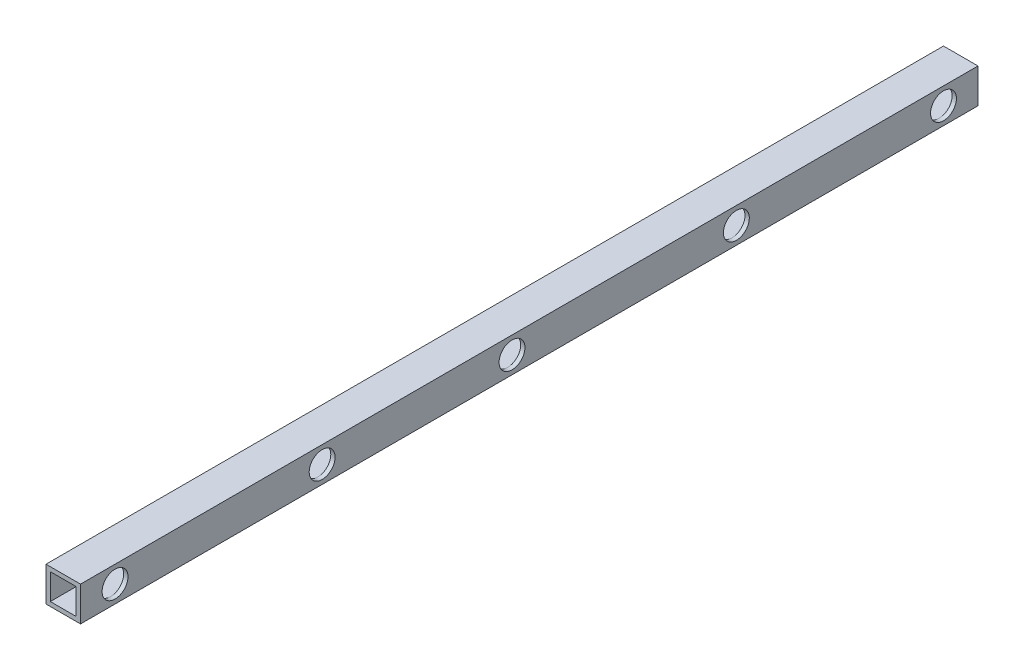
ISO-10303-21;
HEADER;
FILE_DESCRIPTION(('STEP AP214'),'2;1');
FILE_NAME('part.step','',(''),(''),'','','');
FILE_SCHEMA(('AUTOMOTIVE_DESIGN { 1 0 10303 214 1 1 1 1 }'));
ENDSEC;
DATA;
#1=APPLICATION_CONTEXT('core data for automotive mechanical design processes');
#2=APPLICATION_PROTOCOL_DEFINITION('international standard','automotive_design',2000,#1);
#3=PRODUCT_CONTEXT('',#1,'mechanical');
#4=PRODUCT('Part','Part','',(#3));
#5=PRODUCT_RELATED_PRODUCT_CATEGORY('part','',(#4));
#6=PRODUCT_DEFINITION_FORMATION('','',#4);
#7=PRODUCT_DEFINITION_CONTEXT('part definition',#1,'design');
#8=PRODUCT_DEFINITION('design','',#6,#7);
#9=PRODUCT_DEFINITION_SHAPE('','',#8);
#10=(LENGTH_UNIT() NAMED_UNIT(*) SI_UNIT(.MILLI.,.METRE.));
#11=(NAMED_UNIT(*) PLANE_ANGLE_UNIT() SI_UNIT($,.RADIAN.));
#12=(NAMED_UNIT(*) SI_UNIT($,.STERADIAN.) SOLID_ANGLE_UNIT());
#13=UNCERTAINTY_MEASURE_WITH_UNIT(LENGTH_MEASURE(1.E-05),#10,'distance_accuracy_value','');
#14=(GEOMETRIC_REPRESENTATION_CONTEXT(3) GLOBAL_UNCERTAINTY_ASSIGNED_CONTEXT((#13)) GLOBAL_UNIT_ASSIGNED_CONTEXT((#10,
#11,#12)) REPRESENTATION_CONTEXT('',''));
#15=CARTESIAN_POINT('',(0.,0.,0.));
#16=DIRECTION('',(0.,0.,1.));
#17=DIRECTION('',(1.,0.,0.));
#18=AXIS2_PLACEMENT_3D('',#15,#16,#17);
#19=CARTESIAN_POINT('',(-3.175,0.,660.4));
#20=DIRECTION('',(-1.,0.,0.));
#21=DIRECTION('',(0.,-1.,0.));
#22=AXIS2_PLACEMENT_3D('',#19,#20,#21);
#23=PLANE('',#22);
#24=CARTESIAN_POINT('',(-3.175,12.7,25.4));
#25=DIRECTION('',(-1.,0.,0.));
#26=DIRECTION('',(0.,-1.,0.));
#27=AXIS2_PLACEMENT_3D('',#24,#25,#26);
#28=CIRCLE('',#27,9.525);
#29=CARTESIAN_POINT('',(-3.175,3.175,25.4));
#30=VERTEX_POINT('',#29);
#31=CARTESIAN_POINT('',(-3.175,22.225,25.4));
#32=VERTEX_POINT('',#31);
#33=EDGE_CURVE('E77',#30,#32,#28,.T.);
#34=ORIENTED_EDGE('',*,*,#33,.F.);
#35=DIRECTION('',(0.,0.,-1.));
#36=VECTOR('',#35,1.);
#37=CARTESIAN_POINT('',(-3.175,3.175,660.4));
#38=LINE('',#37,#36);
#39=CARTESIAN_POINT('',(-3.175,3.175,177.8));
#40=VERTEX_POINT('',#39);
#41=EDGE_CURVE('E208',#40,#30,#38,.T.);
#42=ORIENTED_EDGE('',*,*,#41,.F.);
#43=CARTESIAN_POINT('',(-3.175,12.7,177.8));
#44=DIRECTION('',(-1.,0.,0.));
#45=DIRECTION('',(0.,-1.,0.));
#46=AXIS2_PLACEMENT_3D('',#43,#44,#45);
#47=CIRCLE('',#46,9.525);
#48=CARTESIAN_POINT('',(-3.175,22.225,177.8));
#49=VERTEX_POINT('',#48);
#50=EDGE_CURVE('E185',#49,#40,#47,.T.);
#51=ORIENTED_EDGE('',*,*,#50,.F.);
#52=DIRECTION('',(0.,0.,-1.));
#53=VECTOR('',#52,1.);
#54=CARTESIAN_POINT('',(-3.175,22.225,660.4));
#55=LINE('',#54,#53);
#56=EDGE_CURVE('E418',#49,#32,#55,.T.);
#57=ORIENTED_EDGE('',*,*,#56,.T.);
#58=EDGE_LOOP('',(#34,#42,#51,#57));
#59=FACE_BOUND('',#58,.T.);
#60=ADVANCED_FACE('F62',(#59),#23,.T.);
#61=CARTESIAN_POINT('',(-3.175,12.7,342.9));
#62=DIRECTION('',(-1.,0.,0.));
#63=DIRECTION('',(0.,-1.,0.));
#64=AXIS2_PLACEMENT_3D('',#61,#62,#63);
#65=CIRCLE('',#64,9.52500000000002);
#66=CARTESIAN_POINT('',(-3.175,3.17499999999999,342.9));
#67=VERTEX_POINT('',#66);
#68=CARTESIAN_POINT('',(-3.175,22.225,342.9));
#69=VERTEX_POINT('',#68);
#70=EDGE_CURVE('E477',#67,#69,#65,.T.);
#71=ORIENTED_EDGE('',*,*,#70,.F.);
#72=CARTESIAN_POINT('',(-3.175,3.17499999999999,482.6));
#73=VERTEX_POINT('',#72);
#74=EDGE_CURVE('E218',#73,#67,#38,.T.);
#75=ORIENTED_EDGE('',*,*,#74,.F.);
#76=CARTESIAN_POINT('',(-3.175,12.7,482.6));
#77=DIRECTION('',(-1.,0.,0.));
#78=DIRECTION('',(0.,-1.,0.));
#79=AXIS2_PLACEMENT_3D('',#76,#77,#78);
#80=CIRCLE('',#79,9.52500000000002);
#81=CARTESIAN_POINT('',(-3.175,22.225,482.6));
#82=VERTEX_POINT('',#81);
#83=EDGE_CURVE('E446',#82,#73,#80,.T.);
#84=ORIENTED_EDGE('',*,*,#83,.F.);
#85=EDGE_CURVE('E368',#82,#69,#55,.T.);
#86=ORIENTED_EDGE('',*,*,#85,.T.);
#87=EDGE_LOOP('',(#71,#75,#84,#86));
#88=FACE_BOUND('',#87,.T.);
#89=ADVANCED_FACE('F316',(#88),#23,.T.);
#90=CARTESIAN_POINT('',(-3.175,12.7,635.));
#91=DIRECTION('',(-1.,0.,0.));
#92=DIRECTION('',(0.,-1.,0.));
#93=AXIS2_PLACEMENT_3D('',#90,#91,#92);
#94=CIRCLE('',#93,9.52500000000002);
#95=CARTESIAN_POINT('',(-3.175,3.17499999999999,635.));
#96=VERTEX_POINT('',#95);
#97=CARTESIAN_POINT('',(-3.175,22.225,635.));
#98=VERTEX_POINT('',#97);
#99=EDGE_CURVE('E361',#96,#98,#94,.T.);
#100=ORIENTED_EDGE('',*,*,#99,.F.);
#101=CARTESIAN_POINT('',(-3.175,3.175,660.4));
#102=VERTEX_POINT('',#101);
#103=EDGE_CURVE('E222',#102,#96,#38,.T.);
#104=ORIENTED_EDGE('',*,*,#103,.F.);
#105=DIRECTION('',(0.,1.,0.));
#106=VECTOR('',#105,1.);
#107=CARTESIAN_POINT('',(-3.175,0.,660.4));
#108=LINE('',#107,#106);
#109=CARTESIAN_POINT('',(-3.175,22.225,660.4));
#110=VERTEX_POINT('',#109);
#111=EDGE_CURVE('E372',#102,#110,#108,.T.);
#112=ORIENTED_EDGE('',*,*,#111,.T.);
#113=EDGE_CURVE('E242',#110,#98,#55,.T.);
#114=ORIENTED_EDGE('',*,*,#113,.T.);
#115=EDGE_LOOP('',(#100,#104,#112,#114));
#116=FACE_BOUND('',#115,.T.);
#117=ADVANCED_FACE('F323',(#116),#23,.T.);
#118=EDGE_CURVE('E355',#98,#96,#94,.T.);
#119=ORIENTED_EDGE('',*,*,#118,.F.);
#120=EDGE_CURVE('E247',#98,#82,#55,.T.);
#121=ORIENTED_EDGE('',*,*,#120,.T.);
#122=EDGE_CURVE('E484',#73,#82,#80,.T.);
#123=ORIENTED_EDGE('',*,*,#122,.F.);
#124=EDGE_CURVE('E221',#96,#73,#38,.T.);
#125=ORIENTED_EDGE('',*,*,#124,.F.);
#126=EDGE_LOOP('',(#119,#121,#123,#125));
#127=FACE_BOUND('',#126,.T.);
#128=ADVANCED_FACE('F339',(#127),#23,.T.);
#129=EDGE_CURVE('E457',#69,#67,#65,.T.);
#130=ORIENTED_EDGE('',*,*,#129,.F.);
#131=EDGE_CURVE('E204',#69,#49,#55,.T.);
#132=ORIENTED_EDGE('',*,*,#131,.T.);
#133=EDGE_CURVE('E84',#40,#49,#47,.T.);
#134=ORIENTED_EDGE('',*,*,#133,.F.);
#135=EDGE_CURVE('E201',#67,#40,#38,.T.);
#136=ORIENTED_EDGE('',*,*,#135,.F.);
#137=EDGE_LOOP('',(#130,#132,#134,#136));
#138=FACE_BOUND('',#137,.T.);
#139=ADVANCED_FACE('F199',(#138),#23,.T.);
#140=CARTESIAN_POINT('',(-22.225,0.,660.4));
#141=DIRECTION('',(1.,0.,0.));
#142=DIRECTION('',(0.,0.,-1.));
#143=AXIS2_PLACEMENT_3D('',#140,#141,#142);
#144=PLANE('',#143);
#145=CARTESIAN_POINT('',(-22.225,12.7,25.4));
#146=DIRECTION('',(1.,0.,0.));
#147=DIRECTION('',(0.,0.,-1.));
#148=AXIS2_PLACEMENT_3D('',#145,#146,#147);
#149=CIRCLE('',#148,9.525);
#150=CARTESIAN_POINT('',(-22.225,22.225,25.4));
#151=VERTEX_POINT('',#150);
#152=CARTESIAN_POINT('',(-22.225,3.175,25.4));
#153=VERTEX_POINT('',#152);
#154=EDGE_CURVE('E472',#151,#153,#149,.T.);
#155=ORIENTED_EDGE('',*,*,#154,.F.);
#156=DIRECTION('',(0.,0.,-1.));
#157=VECTOR('',#156,1.);
#158=CARTESIAN_POINT('',(-22.225,22.225,660.4));
#159=LINE('',#158,#157);
#160=CARTESIAN_POINT('',(-22.225,22.225,177.8));
#161=VERTEX_POINT('',#160);
#162=EDGE_CURVE('E421',#161,#151,#159,.T.);
#163=ORIENTED_EDGE('',*,*,#162,.F.);
#164=CARTESIAN_POINT('',(-22.225,12.7,177.8));
#165=DIRECTION('',(1.,0.,0.));
#166=DIRECTION('',(0.,0.,-1.));
#167=AXIS2_PLACEMENT_3D('',#164,#165,#166);
#168=CIRCLE('',#167,9.525);
#169=CARTESIAN_POINT('',(-22.225,3.175,177.8));
#170=VERTEX_POINT('',#169);
#171=EDGE_CURVE('E469',#170,#161,#168,.T.);
#172=ORIENTED_EDGE('',*,*,#171,.F.);
#173=DIRECTION('',(0.,0.,-1.));
#174=VECTOR('',#173,1.);
#175=CARTESIAN_POINT('',(-22.225,3.175,660.4));
#176=LINE('',#175,#174);
#177=EDGE_CURVE('E413',#170,#153,#176,.T.);
#178=ORIENTED_EDGE('',*,*,#177,.T.);
#179=EDGE_LOOP('',(#155,#163,#172,#178));
#180=FACE_BOUND('',#179,.T.);
#181=ADVANCED_FACE('F338',(#180),#144,.T.);
#182=CARTESIAN_POINT('',(-22.225,12.7,342.9));
#183=DIRECTION('',(1.,0.,0.));
#184=DIRECTION('',(0.,0.,-1.));
#185=AXIS2_PLACEMENT_3D('',#182,#183,#184);
#186=CIRCLE('',#185,9.52500000000002);
#187=CARTESIAN_POINT('',(-22.225,22.225,342.9));
#188=VERTEX_POINT('',#187);
#189=CARTESIAN_POINT('',(-22.225,3.175,342.9));
#190=VERTEX_POINT('',#189);
#191=EDGE_CURVE('E452',#188,#190,#186,.T.);
#192=ORIENTED_EDGE('',*,*,#191,.F.);
#193=CARTESIAN_POINT('',(-22.225,22.225,482.6));
#194=VERTEX_POINT('',#193);
#195=EDGE_CURVE('E426',#194,#188,#159,.T.);
#196=ORIENTED_EDGE('',*,*,#195,.F.);
#197=CARTESIAN_POINT('',(-22.225,12.7,482.6));
#198=DIRECTION('',(1.,0.,0.));
#199=DIRECTION('',(0.,0.,-1.));
#200=AXIS2_PLACEMENT_3D('',#197,#198,#199);
#201=CIRCLE('',#200,9.52500000000002);
#202=CARTESIAN_POINT('',(-22.225,3.175,482.6));
#203=VERTEX_POINT('',#202);
#204=EDGE_CURVE('E206',#203,#194,#201,.T.);
#205=ORIENTED_EDGE('',*,*,#204,.F.);
#206=EDGE_CURVE('E453',#203,#190,#176,.T.);
#207=ORIENTED_EDGE('',*,*,#206,.T.);
#208=EDGE_LOOP('',(#192,#196,#205,#207));
#209=FACE_BOUND('',#208,.T.);
#210=ADVANCED_FACE('F344',(#209),#144,.T.);
#211=CARTESIAN_POINT('',(-22.225,12.7,635.));
#212=DIRECTION('',(1.,0.,0.));
#213=DIRECTION('',(0.,0.,-1.));
#214=AXIS2_PLACEMENT_3D('',#211,#212,#213);
#215=CIRCLE('',#214,9.52500000000002);
#216=CARTESIAN_POINT('',(-22.225,22.225,635.));
#217=VERTEX_POINT('',#216);
#218=CARTESIAN_POINT('',(-22.225,3.175,635.));
#219=VERTEX_POINT('',#218);
#220=EDGE_CURVE('E362',#217,#219,#215,.T.);
#221=ORIENTED_EDGE('',*,*,#220,.F.);
#222=CARTESIAN_POINT('',(-22.225,22.225,660.4));
#223=VERTEX_POINT('',#222);
#224=EDGE_CURVE('E236',#223,#217,#159,.T.);
#225=ORIENTED_EDGE('',*,*,#224,.F.);
#226=DIRECTION('',(0.,-1.,0.));
#227=VECTOR('',#226,1.);
#228=CARTESIAN_POINT('',(-22.225,0.,660.4));
#229=LINE('',#228,#227);
#230=CARTESIAN_POINT('',(-22.225,3.175,660.4));
#231=VERTEX_POINT('',#230);
#232=EDGE_CURVE('E379',#223,#231,#229,.T.);
#233=ORIENTED_EDGE('',*,*,#232,.T.);
#234=EDGE_CURVE('E230',#231,#219,#176,.T.);
#235=ORIENTED_EDGE('',*,*,#234,.T.);
#236=EDGE_LOOP('',(#221,#225,#233,#235));
#237=FACE_BOUND('',#236,.T.);
#238=ADVANCED_FACE('F581',(#237),#144,.T.);
#239=EDGE_CURVE('E440',#219,#217,#215,.T.);
#240=ORIENTED_EDGE('',*,*,#239,.F.);
#241=EDGE_CURVE('E235',#219,#203,#176,.T.);
#242=ORIENTED_EDGE('',*,*,#241,.T.);
#243=EDGE_CURVE('E442',#194,#203,#201,.T.);
#244=ORIENTED_EDGE('',*,*,#243,.F.);
#245=EDGE_CURVE('E241',#217,#194,#159,.T.);
#246=ORIENTED_EDGE('',*,*,#245,.F.);
#247=EDGE_LOOP('',(#240,#242,#244,#246));
#248=FACE_BOUND('',#247,.T.);
#249=ADVANCED_FACE('F438',(#248),#144,.T.);
#250=EDGE_CURVE('E458',#190,#188,#186,.T.);
#251=ORIENTED_EDGE('',*,*,#250,.F.);
#252=EDGE_CURVE('E465',#190,#170,#176,.T.);
#253=ORIENTED_EDGE('',*,*,#252,.T.);
#254=EDGE_CURVE('E193',#161,#170,#168,.T.);
#255=ORIENTED_EDGE('',*,*,#254,.F.);
#256=EDGE_CURVE('E424',#188,#161,#159,.T.);
#257=ORIENTED_EDGE('',*,*,#256,.F.);
#258=EDGE_LOOP('',(#251,#253,#255,#257));
#259=FACE_BOUND('',#258,.T.);
#260=ADVANCED_FACE('F462',(#259),#144,.T.);
#261=CARTESIAN_POINT('',(0.,0.,660.4));
#262=DIRECTION('',(0.,0.,1.));
#263=DIRECTION('',(1.,0.,0.));
#264=AXIS2_PLACEMENT_3D('',#261,#262,#263);
#265=PLANE('',#264);
#266=DIRECTION('',(0.,1.,0.));
#267=VECTOR('',#266,1.);
#268=CARTESIAN_POINT('',(0.,0.,660.4));
#269=LINE('',#268,#267);
#270=CARTESIAN_POINT('',(0.,0.,660.4));
#271=VERTEX_POINT('',#270);
#272=CARTESIAN_POINT('',(0.,25.4,660.4));
#273=VERTEX_POINT('',#272);
#274=EDGE_CURVE('E248',#271,#273,#269,.T.);
#275=ORIENTED_EDGE('',*,*,#274,.T.);
#276=DIRECTION('',(-1.,0.,0.));
#277=VECTOR('',#276,1.);
#278=CARTESIAN_POINT('',(0.,25.4,660.4));
#279=LINE('',#278,#277);
#280=CARTESIAN_POINT('',(-25.4,25.4,660.4));
#281=VERTEX_POINT('',#280);
#282=EDGE_CURVE('E252',#273,#281,#279,.T.);
#283=ORIENTED_EDGE('',*,*,#282,.T.);
#284=DIRECTION('',(0.,-1.,0.));
#285=VECTOR('',#284,1.);
#286=CARTESIAN_POINT('',(-25.4,0.,660.4));
#287=LINE('',#286,#285);
#288=CARTESIAN_POINT('',(-25.4,0.,660.4));
#289=VERTEX_POINT('',#288);
#290=EDGE_CURVE('E256',#281,#289,#287,.T.);
#291=ORIENTED_EDGE('',*,*,#290,.T.);
#292=DIRECTION('',(1.,0.,0.));
#293=VECTOR('',#292,1.);
#294=CARTESIAN_POINT('',(0.,0.,660.4));
#295=LINE('',#294,#293);
#296=EDGE_CURVE('E259',#289,#271,#295,.T.);
#297=ORIENTED_EDGE('',*,*,#296,.T.);
#298=EDGE_LOOP('',(#275,#283,#291,#297));
#299=FACE_BOUND('',#298,.T.);
#300=DIRECTION('',(-1.,0.,0.));
#301=VECTOR('',#300,1.);
#302=CARTESIAN_POINT('',(0.,22.225,660.4));
#303=LINE('',#302,#301);
#304=EDGE_CURVE('E375',#110,#223,#303,.T.);
#305=ORIENTED_EDGE('',*,*,#304,.F.);
#306=ORIENTED_EDGE('',*,*,#111,.F.);
#307=DIRECTION('',(1.,0.,0.));
#308=VECTOR('',#307,1.);
#309=CARTESIAN_POINT('',(0.,3.175,660.4));
#310=LINE('',#309,#308);
#311=EDGE_CURVE('E390',#231,#102,#310,.T.);
#312=ORIENTED_EDGE('',*,*,#311,.F.);
#313=ORIENTED_EDGE('',*,*,#232,.F.);
#314=EDGE_LOOP('',(#305,#306,#312,#313));
#315=FACE_BOUND('',#314,.T.);
#316=ADVANCED_FACE('F302',(#299,#315),#265,.T.);
#317=CARTESIAN_POINT('',(0.,0.,0.));
#318=DIRECTION('',(0.,0.,1.));
#319=DIRECTION('',(1.,0.,0.));
#320=AXIS2_PLACEMENT_3D('',#317,#318,#319);
#321=PLANE('',#320);
#322=DIRECTION('',(0.,1.,0.));
#323=VECTOR('',#322,1.);
#324=CARTESIAN_POINT('',(0.,0.,0.));
#325=LINE('',#324,#323);
#326=CARTESIAN_POINT('',(0.,0.,0.));
#327=VERTEX_POINT('',#326);
#328=CARTESIAN_POINT('',(0.,25.4,0.));
#329=VERTEX_POINT('',#328);
#330=EDGE_CURVE('E246',#327,#329,#325,.T.);
#331=ORIENTED_EDGE('',*,*,#330,.F.);
#332=DIRECTION('',(1.,0.,0.));
#333=VECTOR('',#332,1.);
#334=CARTESIAN_POINT('',(0.,0.,0.));
#335=LINE('',#334,#333);
#336=CARTESIAN_POINT('',(-25.4,0.,0.));
#337=VERTEX_POINT('',#336);
#338=EDGE_CURVE('E253',#337,#327,#335,.T.);
#339=ORIENTED_EDGE('',*,*,#338,.F.);
#340=DIRECTION('',(0.,-1.,0.));
#341=VECTOR('',#340,1.);
#342=CARTESIAN_POINT('',(-25.4,0.,0.));
#343=LINE('',#342,#341);
#344=CARTESIAN_POINT('',(-25.4,25.4,0.));
#345=VERTEX_POINT('',#344);
#346=EDGE_CURVE('E269',#345,#337,#343,.T.);
#347=ORIENTED_EDGE('',*,*,#346,.F.);
#348=DIRECTION('',(-1.,0.,0.));
#349=VECTOR('',#348,1.);
#350=CARTESIAN_POINT('',(0.,25.4,0.));
#351=LINE('',#350,#349);
#352=EDGE_CURVE('E266',#329,#345,#351,.T.);
#353=ORIENTED_EDGE('',*,*,#352,.F.);
#354=EDGE_LOOP('',(#331,#339,#347,#353));
#355=FACE_BOUND('',#354,.T.);
#356=DIRECTION('',(0.,1.,0.));
#357=VECTOR('',#356,1.);
#358=CARTESIAN_POINT('',(-3.175,0.,0.));
#359=LINE('',#358,#357);
#360=CARTESIAN_POINT('',(-3.175,3.175,0.));
#361=VERTEX_POINT('',#360);
#362=CARTESIAN_POINT('',(-3.175,22.225,0.));
#363=VERTEX_POINT('',#362);
#364=EDGE_CURVE('E393',#361,#363,#359,.T.);
#365=ORIENTED_EDGE('',*,*,#364,.T.);
#366=DIRECTION('',(-1.,0.,0.));
#367=VECTOR('',#366,1.);
#368=CARTESIAN_POINT('',(0.,22.225,0.));
#369=LINE('',#368,#367);
#370=CARTESIAN_POINT('',(-22.225,22.225,0.));
#371=VERTEX_POINT('',#370);
#372=EDGE_CURVE('E397',#363,#371,#369,.T.);
#373=ORIENTED_EDGE('',*,*,#372,.T.);
#374=DIRECTION('',(0.,-1.,0.));
#375=VECTOR('',#374,1.);
#376=CARTESIAN_POINT('',(-22.225,0.,0.));
#377=LINE('',#376,#375);
#378=CARTESIAN_POINT('',(-22.225,3.175,0.));
#379=VERTEX_POINT('',#378);
#380=EDGE_CURVE('E382',#371,#379,#377,.T.);
#381=ORIENTED_EDGE('',*,*,#380,.T.);
#382=DIRECTION('',(1.,0.,0.));
#383=VECTOR('',#382,1.);
#384=CARTESIAN_POINT('',(0.,3.175,0.));
#385=LINE('',#384,#383);
#386=EDGE_CURVE('E228',#379,#361,#385,.T.);
#387=ORIENTED_EDGE('',*,*,#386,.T.);
#388=EDGE_LOOP('',(#365,#373,#381,#387));
#389=FACE_BOUND('',#388,.T.);
#390=ADVANCED_FACE('F292',(#355,#389),#321,.F.);
#391=CARTESIAN_POINT('',(0.,0.,660.4));
#392=DIRECTION('',(-1.,0.,0.));
#393=DIRECTION('',(0.,-1.,0.));
#394=AXIS2_PLACEMENT_3D('',#391,#392,#393);
#395=PLANE('',#394);
#396=CARTESIAN_POINT('',(0.,12.7,25.4));
#397=DIRECTION('',(-1.,0.,0.));
#398=DIRECTION('',(0.,0.,1.));
#399=AXIS2_PLACEMENT_3D('',#396,#397,#398);
#400=CIRCLE('',#399,9.525);
#401=CARTESIAN_POINT('',(0.,12.7,34.925));
#402=VERTEX_POINT('',#401);
#403=EDGE_CURVE('E489',#402,#402,#400,.T.);
#404=ORIENTED_EDGE('',*,*,#403,.T.);
#405=EDGE_LOOP('',(#404));
#406=FACE_BOUND('',#405,.T.);
#407=CARTESIAN_POINT('',(0.,12.7,342.9));
#408=DIRECTION('',(-1.,0.,0.));
#409=DIRECTION('',(0.,0.,1.));
#410=AXIS2_PLACEMENT_3D('',#407,#408,#409);
#411=CIRCLE('',#410,9.52500000000002);
#412=CARTESIAN_POINT('',(0.,12.7,352.425));
#413=VERTEX_POINT('',#412);
#414=EDGE_CURVE('E512',#413,#413,#411,.T.);
#415=ORIENTED_EDGE('',*,*,#414,.T.);
#416=EDGE_LOOP('',(#415));
#417=FACE_BOUND('',#416,.T.);
#418=CARTESIAN_POINT('',(0.,12.7,635.));
#419=DIRECTION('',(-1.,0.,0.));
#420=DIRECTION('',(0.,0.,1.));
#421=AXIS2_PLACEMENT_3D('',#418,#419,#420);
#422=CIRCLE('',#421,9.52500000000002);
#423=CARTESIAN_POINT('',(0.,12.7,644.525));
#424=VERTEX_POINT('',#423);
#425=EDGE_CURVE('E495',#424,#424,#422,.T.);
#426=ORIENTED_EDGE('',*,*,#425,.T.);
#427=EDGE_LOOP('',(#426));
#428=FACE_BOUND('',#427,.T.);
#429=CARTESIAN_POINT('',(0.,12.7,482.6));
#430=DIRECTION('',(-1.,0.,0.));
#431=DIRECTION('',(0.,0.,1.));
#432=AXIS2_PLACEMENT_3D('',#429,#430,#431);
#433=CIRCLE('',#432,9.52500000000002);
#434=CARTESIAN_POINT('',(0.,12.7,492.125));
#435=VERTEX_POINT('',#434);
#436=EDGE_CURVE('E494',#435,#435,#433,.T.);
#437=ORIENTED_EDGE('',*,*,#436,.T.);
#438=EDGE_LOOP('',(#437));
#439=FACE_BOUND('',#438,.T.);
#440=CARTESIAN_POINT('',(0.,12.7,177.8));
#441=DIRECTION('',(-1.,0.,0.));
#442=DIRECTION('',(0.,0.,1.));
#443=AXIS2_PLACEMENT_3D('',#440,#441,#442);
#444=CIRCLE('',#443,9.525);
#445=CARTESIAN_POINT('',(0.,12.7,187.325));
#446=VERTEX_POINT('',#445);
#447=EDGE_CURVE('E503',#446,#446,#444,.T.);
#448=ORIENTED_EDGE('',*,*,#447,.T.);
#449=EDGE_LOOP('',(#448));
#450=FACE_BOUND('',#449,.T.);
#451=ORIENTED_EDGE('',*,*,#330,.T.);
#452=DIRECTION('',(0.,0.,-1.));
#453=VECTOR('',#452,1.);
#454=CARTESIAN_POINT('',(0.,25.4,660.4));
#455=LINE('',#454,#453);
#456=EDGE_CURVE('E12',#273,#329,#455,.T.);
#457=ORIENTED_EDGE('',*,*,#456,.F.);
#458=ORIENTED_EDGE('',*,*,#274,.F.);
#459=DIRECTION('',(0.,0.,-1.));
#460=VECTOR('',#459,1.);
#461=CARTESIAN_POINT('',(0.,0.,660.4));
#462=LINE('',#461,#460);
#463=EDGE_CURVE('E262',#271,#327,#462,.T.);
#464=ORIENTED_EDGE('',*,*,#463,.T.);
#465=EDGE_LOOP('',(#451,#457,#458,#464));
#466=FACE_BOUND('',#465,.T.);
#467=ADVANCED_FACE('F64',(#406,#417,#428,#439,#450,#466),#395,.F.);
#468=CARTESIAN_POINT('',(0.,25.4,660.4));
#469=DIRECTION('',(0.,-1.,0.));
#470=DIRECTION('',(1.,0.,0.));
#471=AXIS2_PLACEMENT_3D('',#468,#469,#470);
#472=PLANE('',#471);
#473=ORIENTED_EDGE('',*,*,#352,.T.);
#474=DIRECTION('',(0.,0.,-1.));
#475=VECTOR('',#474,1.);
#476=CARTESIAN_POINT('',(-25.4,25.4,660.4));
#477=LINE('',#476,#475);
#478=EDGE_CURVE('E71',#281,#345,#477,.T.);
#479=ORIENTED_EDGE('',*,*,#478,.F.);
#480=ORIENTED_EDGE('',*,*,#282,.F.);
#481=ORIENTED_EDGE('',*,*,#456,.T.);
#482=EDGE_LOOP('',(#473,#479,#480,#481));
#483=FACE_BOUND('',#482,.T.);
#484=ADVANCED_FACE('F304',(#483),#472,.F.);
#485=CARTESIAN_POINT('',(-25.4,0.,660.4));
#486=DIRECTION('',(1.,0.,0.));
#487=DIRECTION('',(0.,0.,-1.));
#488=AXIS2_PLACEMENT_3D('',#485,#486,#487);
#489=PLANE('',#488);
#490=CARTESIAN_POINT('',(-25.4,12.7,25.4));
#491=DIRECTION('',(-1.,0.,0.));
#492=DIRECTION('',(0.,0.,1.));
#493=AXIS2_PLACEMENT_3D('',#490,#491,#492);
#494=CIRCLE('',#493,9.525);
#495=CARTESIAN_POINT('',(-25.4,12.7,34.925));
#496=VERTEX_POINT('',#495);
#497=EDGE_CURVE('E507',#496,#496,#494,.T.);
#498=ORIENTED_EDGE('',*,*,#497,.F.);
#499=EDGE_LOOP('',(#498));
#500=FACE_BOUND('',#499,.T.);
#501=CARTESIAN_POINT('',(-25.4,12.7,342.9));
#502=DIRECTION('',(-1.,0.,0.));
#503=DIRECTION('',(0.,0.,1.));
#504=AXIS2_PLACEMENT_3D('',#501,#502,#503);
#505=CIRCLE('',#504,9.52500000000002);
#506=CARTESIAN_POINT('',(-25.4,12.7,352.425));
#507=VERTEX_POINT('',#506);
#508=EDGE_CURVE('E508',#507,#507,#505,.T.);
#509=ORIENTED_EDGE('',*,*,#508,.F.);
#510=EDGE_LOOP('',(#509));
#511=FACE_BOUND('',#510,.T.);
#512=CARTESIAN_POINT('',(-25.4,12.7,635.));
#513=DIRECTION('',(-1.,0.,0.));
#514=DIRECTION('',(0.,0.,1.));
#515=AXIS2_PLACEMENT_3D('',#512,#513,#514);
#516=CIRCLE('',#515,9.52500000000002);
#517=CARTESIAN_POINT('',(-25.4,12.7,644.525));
#518=VERTEX_POINT('',#517);
#519=EDGE_CURVE('E516',#518,#518,#516,.T.);
#520=ORIENTED_EDGE('',*,*,#519,.F.);
#521=EDGE_LOOP('',(#520));
#522=FACE_BOUND('',#521,.T.);
#523=CARTESIAN_POINT('',(-25.4,12.7,482.6));
#524=DIRECTION('',(-1.,0.,0.));
#525=DIRECTION('',(0.,0.,1.));
#526=AXIS2_PLACEMENT_3D('',#523,#524,#525);
#527=CIRCLE('',#526,9.52500000000002);
#528=CARTESIAN_POINT('',(-25.4,12.7,492.125));
#529=VERTEX_POINT('',#528);
#530=EDGE_CURVE('E490',#529,#529,#527,.T.);
#531=ORIENTED_EDGE('',*,*,#530,.F.);
#532=EDGE_LOOP('',(#531));
#533=FACE_BOUND('',#532,.T.);
#534=CARTESIAN_POINT('',(-25.4,12.7,177.8));
#535=DIRECTION('',(-1.,0.,0.));
#536=DIRECTION('',(0.,0.,1.));
#537=AXIS2_PLACEMENT_3D('',#534,#535,#536);
#538=CIRCLE('',#537,9.525);
#539=CARTESIAN_POINT('',(-25.4,12.7,187.325));
#540=VERTEX_POINT('',#539);
#541=EDGE_CURVE('E499',#540,#540,#538,.T.);
#542=ORIENTED_EDGE('',*,*,#541,.F.);
#543=EDGE_LOOP('',(#542));
#544=FACE_BOUND('',#543,.T.);
#545=ORIENTED_EDGE('',*,*,#346,.T.);
#546=DIRECTION('',(0.,0.,-1.));
#547=VECTOR('',#546,1.);
#548=CARTESIAN_POINT('',(-25.4,0.,660.4));
#549=LINE('',#548,#547);
#550=EDGE_CURVE('E277',#289,#337,#549,.T.);
#551=ORIENTED_EDGE('',*,*,#550,.F.);
#552=ORIENTED_EDGE('',*,*,#290,.F.);
#553=ORIENTED_EDGE('',*,*,#478,.T.);
#554=EDGE_LOOP('',(#545,#551,#552,#553));
#555=FACE_BOUND('',#554,.T.);
#556=ADVANCED_FACE('F286',(#500,#511,#522,#533,#544,#555),#489,.F.);
#557=CARTESIAN_POINT('',(0.,0.,660.4));
#558=DIRECTION('',(0.,1.,0.));
#559=DIRECTION('',(0.,0.,1.));
#560=AXIS2_PLACEMENT_3D('',#557,#558,#559);
#561=PLANE('',#560);
#562=ORIENTED_EDGE('',*,*,#338,.T.);
#563=ORIENTED_EDGE('',*,*,#463,.F.);
#564=ORIENTED_EDGE('',*,*,#296,.F.);
#565=ORIENTED_EDGE('',*,*,#550,.T.);
#566=EDGE_LOOP('',(#562,#563,#564,#565));
#567=FACE_BOUND('',#566,.T.);
#568=ADVANCED_FACE('F296',(#567),#561,.F.);
#569=EDGE_CURVE('E384',#32,#30,#28,.T.);
#570=ORIENTED_EDGE('',*,*,#569,.F.);
#571=EDGE_CURVE('E240',#32,#363,#55,.T.);
#572=ORIENTED_EDGE('',*,*,#571,.T.);
#573=ORIENTED_EDGE('',*,*,#364,.F.);
#574=EDGE_CURVE('E212',#30,#361,#38,.T.);
#575=ORIENTED_EDGE('',*,*,#574,.F.);
#576=EDGE_LOOP('',(#570,#572,#573,#575));
#577=FACE_BOUND('',#576,.T.);
#578=ADVANCED_FACE('F318',(#577),#23,.T.);
#579=CARTESIAN_POINT('',(0.,22.225,660.4));
#580=DIRECTION('',(0.,-1.,0.));
#581=DIRECTION('',(1.,0.,0.));
#582=AXIS2_PLACEMENT_3D('',#579,#580,#581);
#583=PLANE('',#582);
#584=ORIENTED_EDGE('',*,*,#224,.T.);
#585=ORIENTED_EDGE('',*,*,#245,.T.);
#586=ORIENTED_EDGE('',*,*,#195,.T.);
#587=ORIENTED_EDGE('',*,*,#256,.T.);
#588=ORIENTED_EDGE('',*,*,#162,.T.);
#589=EDGE_CURVE('E234',#151,#371,#159,.T.);
#590=ORIENTED_EDGE('',*,*,#589,.T.);
#591=ORIENTED_EDGE('',*,*,#372,.F.);
#592=ORIENTED_EDGE('',*,*,#571,.F.);
#593=ORIENTED_EDGE('',*,*,#56,.F.);
#594=ORIENTED_EDGE('',*,*,#131,.F.);
#595=ORIENTED_EDGE('',*,*,#85,.F.);
#596=ORIENTED_EDGE('',*,*,#120,.F.);
#597=ORIENTED_EDGE('',*,*,#113,.F.);
#598=ORIENTED_EDGE('',*,*,#304,.T.);
#599=EDGE_LOOP('',(#584,#585,#586,#587,#588,#590,#591,#592,#593,#594,#595,#596,#597,#598));
#600=FACE_BOUND('',#599,.T.);
#601=ADVANCED_FACE('F328',(#600),#583,.T.);
#602=EDGE_CURVE('E409',#153,#151,#149,.T.);
#603=ORIENTED_EDGE('',*,*,#602,.F.);
#604=EDGE_CURVE('E227',#153,#379,#176,.T.);
#605=ORIENTED_EDGE('',*,*,#604,.T.);
#606=ORIENTED_EDGE('',*,*,#380,.F.);
#607=ORIENTED_EDGE('',*,*,#589,.F.);
#608=EDGE_LOOP('',(#603,#605,#606,#607));
#609=FACE_BOUND('',#608,.T.);
#610=ADVANCED_FACE('F333',(#609),#144,.T.);
#611=CARTESIAN_POINT('',(0.,3.175,660.4));
#612=DIRECTION('',(0.,1.,0.));
#613=DIRECTION('',(0.,0.,1.));
#614=AXIS2_PLACEMENT_3D('',#611,#612,#613);
#615=PLANE('',#614);
#616=ORIENTED_EDGE('',*,*,#604,.F.);
#617=ORIENTED_EDGE('',*,*,#177,.F.);
#618=ORIENTED_EDGE('',*,*,#252,.F.);
#619=ORIENTED_EDGE('',*,*,#206,.F.);
#620=ORIENTED_EDGE('',*,*,#241,.F.);
#621=ORIENTED_EDGE('',*,*,#234,.F.);
#622=ORIENTED_EDGE('',*,*,#311,.T.);
#623=ORIENTED_EDGE('',*,*,#103,.T.);
#624=ORIENTED_EDGE('',*,*,#124,.T.);
#625=ORIENTED_EDGE('',*,*,#74,.T.);
#626=ORIENTED_EDGE('',*,*,#135,.T.);
#627=ORIENTED_EDGE('',*,*,#41,.T.);
#628=ORIENTED_EDGE('',*,*,#574,.T.);
#629=ORIENTED_EDGE('',*,*,#386,.F.);
#630=EDGE_LOOP('',(#616,#617,#618,#619,#620,#621,#622,#623,#624,#625,#626,#627,#628,#629));
#631=FACE_BOUND('',#630,.T.);
#632=ADVANCED_FACE('F215',(#631),#615,.T.);
#633=CARTESIAN_POINT('',(0.,12.7,177.8));
#634=DIRECTION('',(-1.,0.,0.));
#635=DIRECTION('',(0.,0.,1.));
#636=AXIS2_PLACEMENT_3D('',#633,#634,#635);
#637=CYLINDRICAL_SURFACE('',#636,9.525);
#638=ORIENTED_EDGE('',*,*,#254,.T.);
#639=ORIENTED_EDGE('',*,*,#171,.T.);
#640=EDGE_LOOP('',(#638,#639));
#641=FACE_BOUND('',#640,.T.);
#642=ORIENTED_EDGE('',*,*,#541,.T.);
#643=EDGE_LOOP('',(#642));
#644=FACE_BOUND('',#643,.T.);
#645=ADVANCED_FACE('F551',(#641,#644),#637,.F.);
#646=CARTESIAN_POINT('',(0.,12.7,482.6));
#647=DIRECTION('',(-1.,0.,0.));
#648=DIRECTION('',(0.,0.,1.));
#649=AXIS2_PLACEMENT_3D('',#646,#647,#648);
#650=CYLINDRICAL_SURFACE('',#649,9.52500000000002);
#651=ORIENTED_EDGE('',*,*,#243,.T.);
#652=ORIENTED_EDGE('',*,*,#204,.T.);
#653=EDGE_LOOP('',(#651,#652));
#654=FACE_BOUND('',#653,.T.);
#655=ORIENTED_EDGE('',*,*,#530,.T.);
#656=EDGE_LOOP('',(#655));
#657=FACE_BOUND('',#656,.T.);
#658=ADVANCED_FACE('F565',(#654,#657),#650,.F.);
#659=CARTESIAN_POINT('',(0.,12.7,635.));
#660=DIRECTION('',(-1.,0.,0.));
#661=DIRECTION('',(0.,0.,1.));
#662=AXIS2_PLACEMENT_3D('',#659,#660,#661);
#663=CYLINDRICAL_SURFACE('',#662,9.52500000000002);
#664=ORIENTED_EDGE('',*,*,#220,.T.);
#665=ORIENTED_EDGE('',*,*,#239,.T.);
#666=EDGE_LOOP('',(#664,#665));
#667=FACE_BOUND('',#666,.T.);
#668=ORIENTED_EDGE('',*,*,#519,.T.);
#669=EDGE_LOOP('',(#668));
#670=FACE_BOUND('',#669,.T.);
#671=ADVANCED_FACE('F552',(#667,#670),#663,.F.);
#672=CARTESIAN_POINT('',(0.,12.7,342.9));
#673=DIRECTION('',(-1.,0.,0.));
#674=DIRECTION('',(0.,0.,1.));
#675=AXIS2_PLACEMENT_3D('',#672,#673,#674);
#676=CYLINDRICAL_SURFACE('',#675,9.52500000000002);
#677=ORIENTED_EDGE('',*,*,#191,.T.);
#678=ORIENTED_EDGE('',*,*,#250,.T.);
#679=EDGE_LOOP('',(#677,#678));
#680=FACE_BOUND('',#679,.T.);
#681=ORIENTED_EDGE('',*,*,#508,.T.);
#682=EDGE_LOOP('',(#681));
#683=FACE_BOUND('',#682,.T.);
#684=ADVANCED_FACE('F542',(#680,#683),#676,.F.);
#685=CARTESIAN_POINT('',(0.,12.7,25.4));
#686=DIRECTION('',(-1.,0.,0.));
#687=DIRECTION('',(0.,0.,1.));
#688=AXIS2_PLACEMENT_3D('',#685,#686,#687);
#689=CYLINDRICAL_SURFACE('',#688,9.525);
#690=ORIENTED_EDGE('',*,*,#154,.T.);
#691=ORIENTED_EDGE('',*,*,#602,.T.);
#692=EDGE_LOOP('',(#690,#691));
#693=FACE_BOUND('',#692,.T.);
#694=ORIENTED_EDGE('',*,*,#497,.T.);
#695=EDGE_LOOP('',(#694));
#696=FACE_BOUND('',#695,.T.);
#697=ADVANCED_FACE('F535',(#693,#696),#689,.F.);
#698=ORIENTED_EDGE('',*,*,#133,.T.);
#699=ORIENTED_EDGE('',*,*,#50,.T.);
#700=EDGE_LOOP('',(#698,#699));
#701=FACE_BOUND('',#700,.T.);
#702=ORIENTED_EDGE('',*,*,#447,.F.);
#703=EDGE_LOOP('',(#702));
#704=FACE_BOUND('',#703,.T.);
#705=ADVANCED_FACE('F186',(#701,#704),#637,.F.);
#706=ORIENTED_EDGE('',*,*,#122,.T.);
#707=ORIENTED_EDGE('',*,*,#83,.T.);
#708=EDGE_LOOP('',(#706,#707));
#709=FACE_BOUND('',#708,.T.);
#710=ORIENTED_EDGE('',*,*,#436,.F.);
#711=EDGE_LOOP('',(#710));
#712=FACE_BOUND('',#711,.T.);
#713=ADVANCED_FACE('F549',(#709,#712),#650,.F.);
#714=ORIENTED_EDGE('',*,*,#99,.T.);
#715=ORIENTED_EDGE('',*,*,#118,.T.);
#716=EDGE_LOOP('',(#714,#715));
#717=FACE_BOUND('',#716,.T.);
#718=ORIENTED_EDGE('',*,*,#425,.F.);
#719=EDGE_LOOP('',(#718));
#720=FACE_BOUND('',#719,.T.);
#721=ADVANCED_FACE('F539',(#717,#720),#663,.F.);
#722=ORIENTED_EDGE('',*,*,#70,.T.);
#723=ORIENTED_EDGE('',*,*,#129,.T.);
#724=EDGE_LOOP('',(#722,#723));
#725=FACE_BOUND('',#724,.T.);
#726=ORIENTED_EDGE('',*,*,#414,.F.);
#727=EDGE_LOOP('',(#726));
#728=FACE_BOUND('',#727,.T.);
#729=ADVANCED_FACE('F533',(#725,#728),#676,.F.);
#730=ORIENTED_EDGE('',*,*,#33,.T.);
#731=ORIENTED_EDGE('',*,*,#569,.T.);
#732=EDGE_LOOP('',(#730,#731));
#733=FACE_BOUND('',#732,.T.);
#734=ORIENTED_EDGE('',*,*,#403,.F.);
#735=EDGE_LOOP('',(#734));
#736=FACE_BOUND('',#735,.T.);
#737=ADVANCED_FACE('F531',(#733,#736),#689,.F.);
#738=CLOSED_SHELL('',(#60,#89,#117,#128,#139,#181,#210,#238,#249,#260,#316,#390,#467,#484,#556,
#568,#578,#601,#610,#632,#645,#658,#671,#684,#697,#705,#713,#721,#729,#737));
#739=MANIFOLD_SOLID_BREP('B2',#738);
#740=ADVANCED_BREP_SHAPE_REPRESENTATION('',(#18,#739),#14);
#741=SHAPE_DEFINITION_REPRESENTATION(#9,#740);
ENDSEC;
END-ISO-10303-21;
